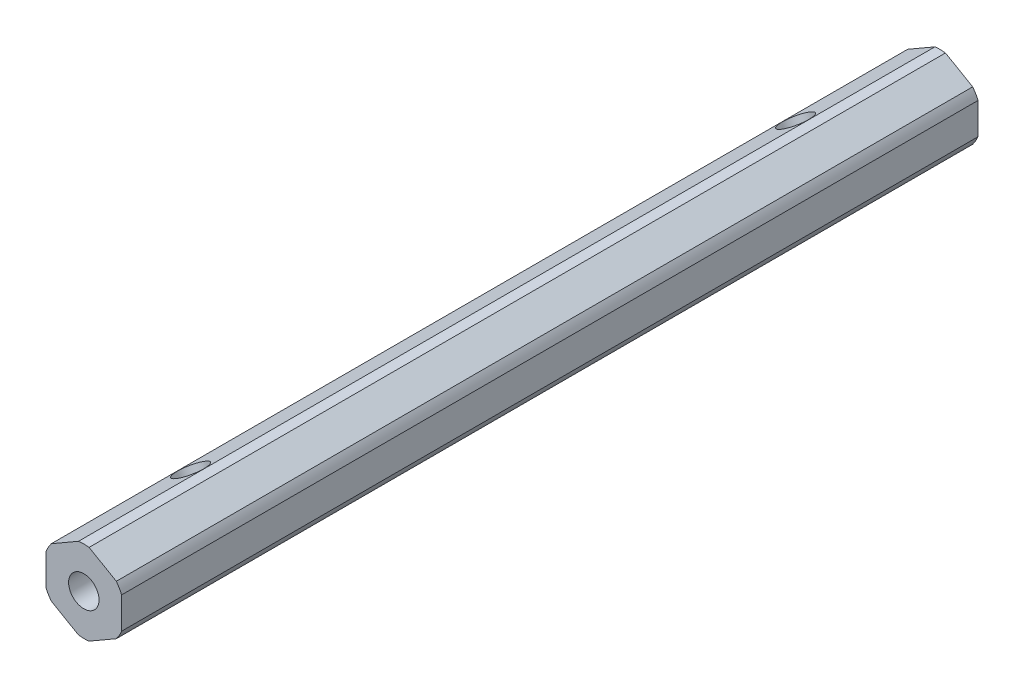
ISO-10303-21;
HEADER;
FILE_DESCRIPTION(('STEP AP214'),'2;1');
FILE_NAME('part.step','',(''),(''),'','','');
FILE_SCHEMA(('AUTOMOTIVE_DESIGN { 1 0 10303 214 1 1 1 1 }'));
ENDSEC;
DATA;
#1=APPLICATION_CONTEXT('core data for automotive mechanical design processes');
#2=APPLICATION_PROTOCOL_DEFINITION('international standard','automotive_design',2000,#1);
#3=PRODUCT_CONTEXT('',#1,'mechanical');
#4=PRODUCT('Part','Part','',(#3));
#5=PRODUCT_RELATED_PRODUCT_CATEGORY('part','',(#4));
#6=PRODUCT_DEFINITION_FORMATION('','',#4);
#7=PRODUCT_DEFINITION_CONTEXT('part definition',#1,'design');
#8=PRODUCT_DEFINITION('design','',#6,#7);
#9=PRODUCT_DEFINITION_SHAPE('','',#8);
#10=(LENGTH_UNIT() NAMED_UNIT(*) SI_UNIT(.MILLI.,.METRE.));
#11=(NAMED_UNIT(*) PLANE_ANGLE_UNIT() SI_UNIT($,.RADIAN.));
#12=(NAMED_UNIT(*) SI_UNIT($,.STERADIAN.) SOLID_ANGLE_UNIT());
#13=UNCERTAINTY_MEASURE_WITH_UNIT(LENGTH_MEASURE(1.E-05),#10,'distance_accuracy_value','');
#14=(GEOMETRIC_REPRESENTATION_CONTEXT(3) GLOBAL_UNCERTAINTY_ASSIGNED_CONTEXT((#13)) GLOBAL_UNIT_ASSIGNED_CONTEXT((#10,
#11,#12)) REPRESENTATION_CONTEXT('',''));
#15=CARTESIAN_POINT('',(0.,0.,0.));
#16=DIRECTION('',(0.,0.,1.));
#17=DIRECTION('',(1.,0.,0.));
#18=AXIS2_PLACEMENT_3D('',#15,#16,#17);
#19=CARTESIAN_POINT('',(0.,0.,457.2));
#20=DIRECTION('',(0.,0.,-1.));
#21=DIRECTION('',(-1.,0.,0.));
#22=AXIS2_PLACEMENT_3D('',#19,#20,#21);
#23=CYLINDRICAL_SURFACE('',#22,2.5527);
#24=CARTESIAN_POINT('',(0.,0.,-71.9105000000002));
#25=DIRECTION('',(0.,0.,1.));
#26=DIRECTION('',(1.,0.,0.));
#27=AXIS2_PLACEMENT_3D('',#24,#25,#26);
#28=CIRCLE('',#27,2.5527);
#29=CARTESIAN_POINT('',(2.5527,0.,-71.9105000000002));
#30=VERTEX_POINT('',#29);
#31=EDGE_CURVE('E165',#30,#30,#28,.F.);
#32=ORIENTED_EDGE('',*,*,#31,.T.);
#33=EDGE_LOOP('',(#32));
#34=FACE_BOUND('',#33,.T.);
#35=CARTESIAN_POINT('',(0.,0.,-50.8));
#36=DIRECTION('',(-0.353553390593274,0.612372435695794,-0.707106781186547));
#37=DIRECTION('',(0.353553390593274,-0.612372435695794,-0.707106781186547));
#38=AXIS2_PLACEMENT_3D('',#35,#36,#37);
#39=ELLIPSE('',#38,3.6100629606698,2.5527);
#40=CARTESIAN_POINT('',(-2.21070304824053,-1.27635,-50.8));
#41=VERTEX_POINT('',#40);
#42=CARTESIAN_POINT('',(2.21070304824053,1.27635,-50.8));
#43=VERTEX_POINT('',#42);
#44=EDGE_CURVE('E55',#41,#43,#39,.F.);
#45=ORIENTED_EDGE('',*,*,#44,.T.);
#46=CARTESIAN_POINT('',(0.,0.,-50.8));
#47=DIRECTION('',(0.353553390593274,-0.612372435695794,-0.707106781186547));
#48=DIRECTION('',(-0.353553390593274,0.612372435695794,-0.707106781186547));
#49=AXIS2_PLACEMENT_3D('',#46,#47,#48);
#50=ELLIPSE('',#49,3.6100629606698,2.5527);
#51=EDGE_CURVE('E12',#43,#41,#50,.F.);
#52=ORIENTED_EDGE('',*,*,#51,.T.);
#53=EDGE_LOOP('',(#45,#52));
#54=FACE_BOUND('',#53,.T.);
#55=ADVANCED_FACE('F42',(#34,#54),#23,.F.);
#56=CARTESIAN_POINT('',(0.,0.,-50.8));
#57=DIRECTION('',(-0.353553390593274,0.612372435695794,-0.707106781186547));
#58=DIRECTION('',(0.353553390593274,-0.612372435695794,-0.707106781186547));
#59=AXIS2_PLACEMENT_3D('',#56,#57,#58);
#60=ELLIPSE('',#59,3.6100629606698,2.5527);
#61=EDGE_CURVE('E144',#41,#43,#60,.T.);
#62=ORIENTED_EDGE('',*,*,#61,.T.);
#63=CARTESIAN_POINT('',(0.,0.,-50.8));
#64=DIRECTION('',(0.353553390593274,-0.612372435695794,-0.707106781186547));
#65=DIRECTION('',(-0.353553390593274,0.612372435695794,-0.707106781186547));
#66=AXIS2_PLACEMENT_3D('',#63,#64,#65);
#67=ELLIPSE('',#66,3.6100629606698,2.5527);
#68=EDGE_CURVE('E50',#43,#41,#67,.T.);
#69=ORIENTED_EDGE('',*,*,#68,.T.);
#70=EDGE_LOOP('',(#62,#69));
#71=FACE_BOUND('',#70,.T.);
#72=CARTESIAN_POINT('',(0.,0.,50.8));
#73=DIRECTION('',(-0.353553390593274,0.612372435695794,-0.707106781186547));
#74=DIRECTION('',(0.353553390593274,-0.612372435695794,-0.707106781186547));
#75=AXIS2_PLACEMENT_3D('',#72,#73,#74);
#76=ELLIPSE('',#75,3.6100629606698,2.5527);
#77=CARTESIAN_POINT('',(-2.21070304824054,-1.27635,50.8));
#78=VERTEX_POINT('',#77);
#79=CARTESIAN_POINT('',(2.21070304824053,1.27635,50.8));
#80=VERTEX_POINT('',#79);
#81=EDGE_CURVE('E62',#78,#80,#76,.F.);
#82=ORIENTED_EDGE('',*,*,#81,.T.);
#83=CARTESIAN_POINT('',(0.,0.,50.8));
#84=DIRECTION('',(0.353553390593274,-0.612372435695794,-0.707106781186547));
#85=DIRECTION('',(-0.353553390593274,0.612372435695794,-0.707106781186547));
#86=AXIS2_PLACEMENT_3D('',#83,#84,#85);
#87=ELLIPSE('',#86,3.6100629606698,2.5527);
#88=EDGE_CURVE('E152',#80,#78,#87,.F.);
#89=ORIENTED_EDGE('',*,*,#88,.T.);
#90=EDGE_LOOP('',(#82,#89));
#91=FACE_BOUND('',#90,.T.);
#92=ADVANCED_FACE('F154',(#71,#91),#23,.F.);
#93=CARTESIAN_POINT('',(6.35,3.66617420935412,457.2));
#94=DIRECTION('',(-0.5,-0.866025403784439,0.));
#95=DIRECTION('',(0.866025403784439,-0.5,0.));
#96=AXIS2_PLACEMENT_3D('',#93,#94,#95);
#97=PLANE('',#96);
#98=DIRECTION('',(0.,0.,-1.));
#99=VECTOR('',#98,1.);
#100=CARTESIAN_POINT('',(5.46158862213451,4.1790987575159,457.2));
#101=LINE('',#100,#99);
#102=CARTESIAN_POINT('',(5.46158862213451,4.1790987575159,-71.9105000000002));
#103=VERTEX_POINT('',#102);
#104=CARTESIAN_POINT('',(5.46158862213451,4.17909875751589,71.9104999999975));
#105=VERTEX_POINT('',#104);
#106=EDGE_CURVE('E177',#103,#105,#101,.F.);
#107=ORIENTED_EDGE('',*,*,#106,.F.);
#108=DIRECTION('',(-0.866025403784439,0.5,0.));
#109=VECTOR('',#108,1.);
#110=CARTESIAN_POINT('',(6.35,3.66617420935412,-71.9105000000002));
#111=LINE('',#110,#109);
#112=CARTESIAN_POINT('',(0.888411377865497,6.81942387054648,-71.9105000000002));
#113=VERTEX_POINT('',#112);
#114=EDGE_CURVE('E260',#103,#113,#111,.T.);
#115=ORIENTED_EDGE('',*,*,#114,.T.);
#116=DIRECTION('',(0.,0.,-1.));
#117=VECTOR('',#116,1.);
#118=CARTESIAN_POINT('',(0.888411377865497,6.81942387054648,457.2));
#119=LINE('',#118,#117);
#120=CARTESIAN_POINT('',(0.888411377865497,6.81942387054648,71.9104999999975));
#121=VERTEX_POINT('',#120);
#122=EDGE_CURVE('E164',#121,#113,#119,.T.);
#123=ORIENTED_EDGE('',*,*,#122,.F.);
#124=DIRECTION('',(0.866025403784439,-0.5,0.));
#125=VECTOR('',#124,1.);
#126=CARTESIAN_POINT('',(6.35,3.66617420935412,71.9104999999975));
#127=LINE('',#126,#125);
#128=EDGE_CURVE('E230',#121,#105,#127,.T.);
#129=ORIENTED_EDGE('',*,*,#128,.T.);
#130=EDGE_LOOP('',(#107,#115,#123,#129));
#131=FACE_BOUND('',#130,.T.);
#132=ADVANCED_FACE('F44',(#131),#97,.F.);
#133=CARTESIAN_POINT('',(0.,7.33234841870825,457.2));
#134=DIRECTION('',(0.5,-0.866025403784439,0.));
#135=DIRECTION('',(0.866025403784439,0.5,0.));
#136=AXIS2_PLACEMENT_3D('',#133,#134,#135);
#137=PLANE('',#136);
#138=CARTESIAN_POINT('',(-3.175,5.49926131403119,-50.8));
#139=DIRECTION('',(0.5,-0.866025403784439,0.));
#140=DIRECTION('',(0.866025403784439,0.5,0.));
#141=AXIS2_PLACEMENT_3D('',#138,#139,#140);
#142=CIRCLE('',#141,2.55269999999999);
#143=CARTESIAN_POINT('',(-0.964296951759469,6.77561131403118,-50.8));
#144=VERTEX_POINT('',#143);
#145=EDGE_CURVE('E272',#144,#144,#142,.T.);
#146=ORIENTED_EDGE('',*,*,#145,.T.);
#147=EDGE_LOOP('',(#146));
#148=FACE_BOUND('',#147,.T.);
#149=CARTESIAN_POINT('',(-3.17500000000001,5.49926131403118,50.8));
#150=DIRECTION('',(0.5,-0.866025403784439,0.));
#151=DIRECTION('',(0.866025403784439,0.5,0.));
#152=AXIS2_PLACEMENT_3D('',#149,#150,#151);
#153=CIRCLE('',#152,2.55269999999999);
#154=CARTESIAN_POINT('',(-0.964296951759474,6.77561131403118,50.8));
#155=VERTEX_POINT('',#154);
#156=EDGE_CURVE('E169',#155,#155,#153,.T.);
#157=ORIENTED_EDGE('',*,*,#156,.T.);
#158=EDGE_LOOP('',(#157));
#159=FACE_BOUND('',#158,.T.);
#160=DIRECTION('',(0.,0.,-1.));
#161=VECTOR('',#160,1.);
#162=CARTESIAN_POINT('',(-0.888411377865494,6.81942387054648,457.2));
#163=LINE('',#162,#161);
#164=CARTESIAN_POINT('',(-0.888411377865494,6.81942387054648,-71.9105000000002));
#165=VERTEX_POINT('',#164);
#166=CARTESIAN_POINT('',(-0.888411377865494,6.81942387054648,71.9104999999975));
#167=VERTEX_POINT('',#166);
#168=EDGE_CURVE('E182',#165,#167,#163,.F.);
#169=ORIENTED_EDGE('',*,*,#168,.F.);
#170=DIRECTION('',(-0.866025403784439,-0.5,0.));
#171=VECTOR('',#170,1.);
#172=CARTESIAN_POINT('',(0.,7.33234841870825,-71.9105000000002));
#173=LINE('',#172,#171);
#174=CARTESIAN_POINT('',(-5.46158862213451,4.1790987575159,-71.9105000000002));
#175=VERTEX_POINT('',#174);
#176=EDGE_CURVE('E250',#165,#175,#173,.T.);
#177=ORIENTED_EDGE('',*,*,#176,.T.);
#178=DIRECTION('',(0.,0.,-1.));
#179=VECTOR('',#178,1.);
#180=CARTESIAN_POINT('',(-5.46158862213451,4.1790987575159,457.2));
#181=LINE('',#180,#179);
#182=CARTESIAN_POINT('',(-5.46158862213451,4.1790987575159,71.9104999999975));
#183=VERTEX_POINT('',#182);
#184=EDGE_CURVE('E179',#183,#175,#181,.T.);
#185=ORIENTED_EDGE('',*,*,#184,.F.);
#186=DIRECTION('',(0.866025403784439,0.5,0.));
#187=VECTOR('',#186,1.);
#188=CARTESIAN_POINT('',(0.,7.33234841870825,71.9104999999975));
#189=LINE('',#188,#187);
#190=EDGE_CURVE('E218',#183,#167,#189,.T.);
#191=ORIENTED_EDGE('',*,*,#190,.T.);
#192=EDGE_LOOP('',(#169,#177,#185,#191));
#193=FACE_BOUND('',#192,.T.);
#194=ADVANCED_FACE('F326',(#148,#159,#193),#137,.F.);
#195=CARTESIAN_POINT('',(-6.35,3.66617420935413,457.2));
#196=DIRECTION('',(1.,0.,0.));
#197=DIRECTION('',(0.,0.,-1.));
#198=AXIS2_PLACEMENT_3D('',#195,#196,#197);
#199=PLANE('',#198);
#200=DIRECTION('',(0.,0.,-1.));
#201=VECTOR('',#200,1.);
#202=CARTESIAN_POINT('',(-6.35,2.64032511303059,457.2));
#203=LINE('',#202,#201);
#204=CARTESIAN_POINT('',(-6.35,2.64032511303059,-71.9105000000002));
#205=VERTEX_POINT('',#204);
#206=CARTESIAN_POINT('',(-6.35,2.64032511303059,71.9104999999975));
#207=VERTEX_POINT('',#206);
#208=EDGE_CURVE('E187',#205,#207,#203,.F.);
#209=ORIENTED_EDGE('',*,*,#208,.F.);
#210=DIRECTION('',(0.,-1.,0.));
#211=VECTOR('',#210,1.);
#212=CARTESIAN_POINT('',(-6.35,3.66617420935413,-71.9105000000002));
#213=LINE('',#212,#211);
#214=CARTESIAN_POINT('',(-6.35,-2.64032511303059,-71.9105000000002));
#215=VERTEX_POINT('',#214);
#216=EDGE_CURVE('E240',#205,#215,#213,.T.);
#217=ORIENTED_EDGE('',*,*,#216,.T.);
#218=DIRECTION('',(0.,0.,-1.));
#219=VECTOR('',#218,1.);
#220=CARTESIAN_POINT('',(-6.35,-2.64032511303059,457.2));
#221=LINE('',#220,#219);
#222=CARTESIAN_POINT('',(-6.35,-2.64032511303059,71.9104999999975));
#223=VERTEX_POINT('',#222);
#224=EDGE_CURVE('E184',#223,#215,#221,.T.);
#225=ORIENTED_EDGE('',*,*,#224,.F.);
#226=DIRECTION('',(0.,1.,0.));
#227=VECTOR('',#226,1.);
#228=CARTESIAN_POINT('',(-6.35,3.66617420935413,71.9104999999975));
#229=LINE('',#228,#227);
#230=EDGE_CURVE('E206',#223,#207,#229,.T.);
#231=ORIENTED_EDGE('',*,*,#230,.T.);
#232=EDGE_LOOP('',(#209,#217,#225,#231));
#233=FACE_BOUND('',#232,.T.);
#234=ADVANCED_FACE('F319',(#233),#199,.F.);
#235=CARTESIAN_POINT('',(-6.35,-3.66617420935413,457.2));
#236=DIRECTION('',(0.5,0.866025403784439,0.));
#237=DIRECTION('',(-0.866025403784439,0.5,0.));
#238=AXIS2_PLACEMENT_3D('',#235,#236,#237);
#239=PLANE('',#238);
#240=DIRECTION('',(0.,0.,-1.));
#241=VECTOR('',#240,1.);
#242=CARTESIAN_POINT('',(-5.4615886221345,-4.1790987575159,457.2));
#243=LINE('',#242,#241);
#244=CARTESIAN_POINT('',(-5.4615886221345,-4.1790987575159,-71.9105000000002));
#245=VERTEX_POINT('',#244);
#246=CARTESIAN_POINT('',(-5.4615886221345,-4.1790987575159,71.9104999999975));
#247=VERTEX_POINT('',#246);
#248=EDGE_CURVE('E192',#245,#247,#243,.F.);
#249=ORIENTED_EDGE('',*,*,#248,.F.);
#250=DIRECTION('',(0.866025403784439,-0.5,0.));
#251=VECTOR('',#250,1.);
#252=CARTESIAN_POINT('',(-6.35,-3.66617420935413,-71.9105000000002));
#253=LINE('',#252,#251);
#254=CARTESIAN_POINT('',(-0.888411377865503,-6.81942387054648,-71.9105000000002));
#255=VERTEX_POINT('',#254);
#256=EDGE_CURVE('E242',#245,#255,#253,.T.);
#257=ORIENTED_EDGE('',*,*,#256,.T.);
#258=DIRECTION('',(0.,0.,-1.));
#259=VECTOR('',#258,1.);
#260=CARTESIAN_POINT('',(-0.888411377865503,-6.81942387054648,457.2));
#261=LINE('',#260,#259);
#262=CARTESIAN_POINT('',(-0.888411377865503,-6.81942387054648,71.9104999999975));
#263=VERTEX_POINT('',#262);
#264=EDGE_CURVE('E189',#263,#255,#261,.T.);
#265=ORIENTED_EDGE('',*,*,#264,.F.);
#266=DIRECTION('',(-0.866025403784439,0.5,0.));
#267=VECTOR('',#266,1.);
#268=CARTESIAN_POINT('',(-6.35,-3.66617420935413,71.9104999999975));
#269=LINE('',#268,#267);
#270=EDGE_CURVE('E209',#263,#247,#269,.T.);
#271=ORIENTED_EDGE('',*,*,#270,.T.);
#272=EDGE_LOOP('',(#249,#257,#265,#271));
#273=FACE_BOUND('',#272,.T.);
#274=ADVANCED_FACE('F284',(#273),#239,.F.);
#275=CARTESIAN_POINT('',(0.,-7.33234841870825,457.2));
#276=DIRECTION('',(-0.5,0.866025403784439,0.));
#277=DIRECTION('',(-0.866025403784439,-0.5,0.));
#278=AXIS2_PLACEMENT_3D('',#275,#276,#277);
#279=PLANE('',#278);
#280=CARTESIAN_POINT('',(3.175,-5.49926131403119,-50.8));
#281=DIRECTION('',(0.5,-0.866025403784439,0.));
#282=DIRECTION('',(0.866025403784439,0.5,0.));
#283=AXIS2_PLACEMENT_3D('',#280,#281,#282);
#284=CIRCLE('',#283,2.55269999999999);
#285=CARTESIAN_POINT('',(5.38570304824053,-4.22291131403119,-50.8));
#286=VERTEX_POINT('',#285);
#287=EDGE_CURVE('E275',#286,#286,#284,.T.);
#288=ORIENTED_EDGE('',*,*,#287,.F.);
#289=EDGE_LOOP('',(#288));
#290=FACE_BOUND('',#289,.T.);
#291=CARTESIAN_POINT('',(3.17499999999999,-5.49926131403119,50.8));
#292=DIRECTION('',(0.5,-0.866025403784439,0.));
#293=DIRECTION('',(0.866025403784439,0.5,0.));
#294=AXIS2_PLACEMENT_3D('',#291,#292,#293);
#295=CIRCLE('',#294,2.55269999999999);
#296=CARTESIAN_POINT('',(5.38570304824052,-4.2229113140312,50.8));
#297=VERTEX_POINT('',#296);
#298=EDGE_CURVE('E269',#297,#297,#295,.T.);
#299=ORIENTED_EDGE('',*,*,#298,.F.);
#300=EDGE_LOOP('',(#299));
#301=FACE_BOUND('',#300,.T.);
#302=DIRECTION('',(0.,0.,-1.));
#303=VECTOR('',#302,1.);
#304=CARTESIAN_POINT('',(0.888411377865483,-6.81942387054648,457.2));
#305=LINE('',#304,#303);
#306=CARTESIAN_POINT('',(0.888411377865483,-6.81942387054648,-71.9105000000002));
#307=VERTEX_POINT('',#306);
#308=CARTESIAN_POINT('',(0.888411377865483,-6.81942387054648,71.9104999999975));
#309=VERTEX_POINT('',#308);
#310=EDGE_CURVE('E197',#307,#309,#305,.F.);
#311=ORIENTED_EDGE('',*,*,#310,.F.);
#312=DIRECTION('',(0.866025403784439,0.5,0.));
#313=VECTOR('',#312,1.);
#314=CARTESIAN_POINT('',(0.,-7.33234841870825,-71.9105000000002));
#315=LINE('',#314,#313);
#316=CARTESIAN_POINT('',(5.46158862213451,-4.17909875751589,-71.9105000000002));
#317=VERTEX_POINT('',#316);
#318=EDGE_CURVE('E252',#307,#317,#315,.T.);
#319=ORIENTED_EDGE('',*,*,#318,.T.);
#320=DIRECTION('',(0.,0.,-1.));
#321=VECTOR('',#320,1.);
#322=CARTESIAN_POINT('',(5.46158862213451,-4.17909875751589,457.2));
#323=LINE('',#322,#321);
#324=CARTESIAN_POINT('',(5.46158862213451,-4.17909875751589,71.9104999999975));
#325=VERTEX_POINT('',#324);
#326=EDGE_CURVE('E194',#325,#317,#323,.T.);
#327=ORIENTED_EDGE('',*,*,#326,.F.);
#328=DIRECTION('',(-0.866025403784439,-0.5,0.));
#329=VECTOR('',#328,1.);
#330=CARTESIAN_POINT('',(0.,-7.33234841870825,71.9104999999975));
#331=LINE('',#330,#329);
#332=EDGE_CURVE('E221',#325,#309,#331,.T.);
#333=ORIENTED_EDGE('',*,*,#332,.T.);
#334=EDGE_LOOP('',(#311,#319,#327,#333));
#335=FACE_BOUND('',#334,.T.);
#336=ADVANCED_FACE('F280',(#290,#301,#335),#279,.F.);
#337=CARTESIAN_POINT('',(6.35,-3.66617420935413,457.2));
#338=DIRECTION('',(-1.,0.,0.));
#339=DIRECTION('',(0.,0.,1.));
#340=AXIS2_PLACEMENT_3D('',#337,#338,#339);
#341=PLANE('',#340);
#342=DIRECTION('',(0.,0.,-1.));
#343=VECTOR('',#342,1.);
#344=CARTESIAN_POINT('',(6.35,-2.64032511303059,457.2));
#345=LINE('',#344,#343);
#346=CARTESIAN_POINT('',(6.35,-2.64032511303059,-71.9105000000002));
#347=VERTEX_POINT('',#346);
#348=CARTESIAN_POINT('',(6.35,-2.64032511303059,71.9104999999975));
#349=VERTEX_POINT('',#348);
#350=EDGE_CURVE('E201',#347,#349,#345,.F.);
#351=ORIENTED_EDGE('',*,*,#350,.F.);
#352=DIRECTION('',(0.,1.,0.));
#353=VECTOR('',#352,1.);
#354=CARTESIAN_POINT('',(6.35,-3.66617420935413,-71.9105000000002));
#355=LINE('',#354,#353);
#356=CARTESIAN_POINT('',(6.35,2.64032511303059,-71.9105000000002));
#357=VERTEX_POINT('',#356);
#358=EDGE_CURVE('E262',#347,#357,#355,.T.);
#359=ORIENTED_EDGE('',*,*,#358,.T.);
#360=DIRECTION('',(0.,0.,-1.));
#361=VECTOR('',#360,1.);
#362=CARTESIAN_POINT('',(6.35,2.64032511303059,457.2));
#363=LINE('',#362,#361);
#364=CARTESIAN_POINT('',(6.35,2.64032511303059,71.9104999999975));
#365=VERTEX_POINT('',#364);
#366=EDGE_CURVE('E199',#365,#357,#363,.T.);
#367=ORIENTED_EDGE('',*,*,#366,.F.);
#368=DIRECTION('',(0.,-1.,0.));
#369=VECTOR('',#368,1.);
#370=CARTESIAN_POINT('',(6.35,-3.66617420935413,71.9104999999975));
#371=LINE('',#370,#369);
#372=EDGE_CURVE('E233',#365,#349,#371,.T.);
#373=ORIENTED_EDGE('',*,*,#372,.T.);
#374=EDGE_LOOP('',(#351,#359,#367,#373));
#375=FACE_BOUND('',#374,.T.);
#376=ADVANCED_FACE('F283',(#375),#341,.F.);
#377=CARTESIAN_POINT('',(0.,0.,457.2));
#378=DIRECTION('',(0.,0.,-1.));
#379=DIRECTION('',(-1.,0.,0.));
#380=AXIS2_PLACEMENT_3D('',#377,#378,#379);
#381=CYLINDRICAL_SURFACE('',#380,6.87705);
#382=CARTESIAN_POINT('',(0.,0.,-71.9105000000002));
#383=DIRECTION('',(0.,0.,1.));
#384=DIRECTION('',(1.,0.,0.));
#385=AXIS2_PLACEMENT_3D('',#382,#383,#384);
#386=CIRCLE('',#385,6.87705);
#387=EDGE_CURVE('E254',#347,#317,#386,.F.);
#388=ORIENTED_EDGE('',*,*,#387,.F.);
#389=ORIENTED_EDGE('',*,*,#350,.T.);
#390=CARTESIAN_POINT('',(0.,0.,71.9104999999975));
#391=DIRECTION('',(0.,0.,-1.));
#392=DIRECTION('',(-1.,0.,0.));
#393=AXIS2_PLACEMENT_3D('',#390,#391,#392);
#394=CIRCLE('',#393,6.87705);
#395=EDGE_CURVE('E224',#325,#349,#394,.F.);
#396=ORIENTED_EDGE('',*,*,#395,.F.);
#397=ORIENTED_EDGE('',*,*,#326,.T.);
#398=EDGE_LOOP('',(#388,#389,#396,#397));
#399=FACE_BOUND('',#398,.T.);
#400=ADVANCED_FACE('F300',(#399),#381,.T.);
#401=CARTESIAN_POINT('',(0.,0.,-71.9105000000002));
#402=DIRECTION('',(0.,0.,1.));
#403=DIRECTION('',(1.,0.,0.));
#404=AXIS2_PLACEMENT_3D('',#401,#402,#403);
#405=CIRCLE('',#404,6.87705);
#406=EDGE_CURVE('E244',#307,#255,#405,.F.);
#407=ORIENTED_EDGE('',*,*,#406,.F.);
#408=ORIENTED_EDGE('',*,*,#310,.T.);
#409=CARTESIAN_POINT('',(0.,0.,71.9104999999975));
#410=DIRECTION('',(0.,0.,-1.));
#411=DIRECTION('',(-1.,0.,0.));
#412=AXIS2_PLACEMENT_3D('',#409,#410,#411);
#413=CIRCLE('',#412,6.87705);
#414=EDGE_CURVE('E212',#263,#309,#413,.F.);
#415=ORIENTED_EDGE('',*,*,#414,.F.);
#416=ORIENTED_EDGE('',*,*,#264,.T.);
#417=EDGE_LOOP('',(#407,#408,#415,#416));
#418=FACE_BOUND('',#417,.T.);
#419=ADVANCED_FACE('F310',(#418),#381,.T.);
#420=CARTESIAN_POINT('',(0.,0.,-71.9105000000002));
#421=DIRECTION('',(0.,0.,1.));
#422=DIRECTION('',(1.,0.,0.));
#423=AXIS2_PLACEMENT_3D('',#420,#421,#422);
#424=CIRCLE('',#423,6.87705);
#425=EDGE_CURVE('E174',#245,#215,#424,.F.);
#426=ORIENTED_EDGE('',*,*,#425,.F.);
#427=ORIENTED_EDGE('',*,*,#248,.T.);
#428=CARTESIAN_POINT('',(0.,0.,71.9104999999975));
#429=DIRECTION('',(0.,0.,-1.));
#430=DIRECTION('',(-1.,0.,0.));
#431=AXIS2_PLACEMENT_3D('',#428,#429,#430);
#432=CIRCLE('',#431,6.87705);
#433=EDGE_CURVE('E203',#223,#247,#432,.F.);
#434=ORIENTED_EDGE('',*,*,#433,.F.);
#435=ORIENTED_EDGE('',*,*,#224,.T.);
#436=EDGE_LOOP('',(#426,#427,#434,#435));
#437=FACE_BOUND('',#436,.T.);
#438=ADVANCED_FACE('F315',(#437),#381,.T.);
#439=CARTESIAN_POINT('',(0.,0.,-71.9105000000002));
#440=DIRECTION('',(0.,0.,1.));
#441=DIRECTION('',(1.,0.,0.));
#442=AXIS2_PLACEMENT_3D('',#439,#440,#441);
#443=CIRCLE('',#442,6.87705);
#444=EDGE_CURVE('E247',#205,#175,#443,.F.);
#445=ORIENTED_EDGE('',*,*,#444,.F.);
#446=ORIENTED_EDGE('',*,*,#208,.T.);
#447=CARTESIAN_POINT('',(0.,0.,71.9104999999975));
#448=DIRECTION('',(0.,0.,-1.));
#449=DIRECTION('',(-1.,0.,0.));
#450=AXIS2_PLACEMENT_3D('',#447,#448,#449);
#451=CIRCLE('',#450,6.87705);
#452=EDGE_CURVE('E215',#183,#207,#451,.F.);
#453=ORIENTED_EDGE('',*,*,#452,.F.);
#454=ORIENTED_EDGE('',*,*,#184,.T.);
#455=EDGE_LOOP('',(#445,#446,#453,#454));
#456=FACE_BOUND('',#455,.T.);
#457=ADVANCED_FACE('F323',(#456),#381,.T.);
#458=CARTESIAN_POINT('',(0.,0.,-71.9105000000002));
#459=DIRECTION('',(0.,0.,1.));
#460=DIRECTION('',(1.,0.,0.));
#461=AXIS2_PLACEMENT_3D('',#458,#459,#460);
#462=CIRCLE('',#461,6.87705);
#463=EDGE_CURVE('E257',#165,#113,#462,.F.);
#464=ORIENTED_EDGE('',*,*,#463,.F.);
#465=ORIENTED_EDGE('',*,*,#168,.T.);
#466=CARTESIAN_POINT('',(0.,0.,71.9104999999975));
#467=DIRECTION('',(0.,0.,-1.));
#468=DIRECTION('',(-1.,0.,0.));
#469=AXIS2_PLACEMENT_3D('',#466,#467,#468);
#470=CIRCLE('',#469,6.87705);
#471=EDGE_CURVE('E227',#121,#167,#470,.F.);
#472=ORIENTED_EDGE('',*,*,#471,.F.);
#473=ORIENTED_EDGE('',*,*,#122,.T.);
#474=EDGE_LOOP('',(#464,#465,#472,#473));
#475=FACE_BOUND('',#474,.T.);
#476=ADVANCED_FACE('F330',(#475),#381,.T.);
#477=CARTESIAN_POINT('',(0.,0.,-71.9105000000002));
#478=DIRECTION('',(0.,0.,1.));
#479=DIRECTION('',(1.,0.,0.));
#480=AXIS2_PLACEMENT_3D('',#477,#478,#479);
#481=CIRCLE('',#480,6.87705);
#482=EDGE_CURVE('E168',#103,#357,#481,.F.);
#483=ORIENTED_EDGE('',*,*,#482,.F.);
#484=ORIENTED_EDGE('',*,*,#106,.T.);
#485=CARTESIAN_POINT('',(0.,0.,71.9104999999975));
#486=DIRECTION('',(0.,0.,-1.));
#487=DIRECTION('',(-1.,0.,0.));
#488=AXIS2_PLACEMENT_3D('',#485,#486,#487);
#489=CIRCLE('',#488,6.87705);
#490=EDGE_CURVE('E173',#365,#105,#489,.F.);
#491=ORIENTED_EDGE('',*,*,#490,.F.);
#492=ORIENTED_EDGE('',*,*,#366,.T.);
#493=EDGE_LOOP('',(#483,#484,#491,#492));
#494=FACE_BOUND('',#493,.T.);
#495=ADVANCED_FACE('F336',(#494),#381,.T.);
#496=CARTESIAN_POINT('',(0.,0.,50.8));
#497=DIRECTION('',(-0.353553390593274,0.612372435695794,-0.707106781186547));
#498=DIRECTION('',(0.353553390593274,-0.612372435695794,-0.707106781186547));
#499=AXIS2_PLACEMENT_3D('',#496,#497,#498);
#500=ELLIPSE('',#499,3.6100629606698,2.5527);
#501=EDGE_CURVE('E160',#78,#80,#500,.T.);
#502=ORIENTED_EDGE('',*,*,#501,.T.);
#503=CARTESIAN_POINT('',(0.,0.,50.8));
#504=DIRECTION('',(0.353553390593274,-0.612372435695794,-0.707106781186547));
#505=DIRECTION('',(-0.353553390593274,0.612372435695794,-0.707106781186547));
#506=AXIS2_PLACEMENT_3D('',#503,#504,#505);
#507=ELLIPSE('',#506,3.6100629606698,2.5527);
#508=EDGE_CURVE('E157',#80,#78,#507,.T.);
#509=ORIENTED_EDGE('',*,*,#508,.T.);
#510=EDGE_LOOP('',(#502,#509));
#511=FACE_BOUND('',#510,.T.);
#512=CARTESIAN_POINT('',(0.,0.,71.9104999999975));
#513=DIRECTION('',(0.,0.,-1.));
#514=DIRECTION('',(-1.,0.,0.));
#515=AXIS2_PLACEMENT_3D('',#512,#513,#514);
#516=CIRCLE('',#515,2.5527);
#517=CARTESIAN_POINT('',(-2.5527,0.,71.9104999999975));
#518=VERTEX_POINT('',#517);
#519=EDGE_CURVE('E170',#518,#518,#516,.F.);
#520=ORIENTED_EDGE('',*,*,#519,.T.);
#521=EDGE_LOOP('',(#520));
#522=FACE_BOUND('',#521,.T.);
#523=ADVANCED_FACE('F338',(#511,#522),#23,.F.);
#524=CARTESIAN_POINT('',(0.,-1.0222280435009E-13,71.9104999999975));
#525=DIRECTION('',(0.,0.,-1.));
#526=DIRECTION('',(-1.,0.,0.));
#527=AXIS2_PLACEMENT_3D('',#524,#525,#526);
#528=PLANE('',#527);
#529=ORIENTED_EDGE('',*,*,#230,.F.);
#530=ORIENTED_EDGE('',*,*,#433,.T.);
#531=ORIENTED_EDGE('',*,*,#270,.F.);
#532=ORIENTED_EDGE('',*,*,#414,.T.);
#533=ORIENTED_EDGE('',*,*,#332,.F.);
#534=ORIENTED_EDGE('',*,*,#395,.T.);
#535=ORIENTED_EDGE('',*,*,#372,.F.);
#536=ORIENTED_EDGE('',*,*,#490,.T.);
#537=ORIENTED_EDGE('',*,*,#128,.F.);
#538=ORIENTED_EDGE('',*,*,#471,.T.);
#539=ORIENTED_EDGE('',*,*,#190,.F.);
#540=ORIENTED_EDGE('',*,*,#452,.T.);
#541=EDGE_LOOP('',(#529,#530,#531,#532,#533,#534,#535,#536,#537,#538,#539,#540));
#542=FACE_BOUND('',#541,.T.);
#543=ORIENTED_EDGE('',*,*,#519,.F.);
#544=EDGE_LOOP('',(#543));
#545=FACE_BOUND('',#544,.T.);
#546=ADVANCED_FACE('F306',(#542,#545),#528,.F.);
#547=CARTESIAN_POINT('',(0.,0.,-71.9105000000001));
#548=DIRECTION('',(0.,0.,1.));
#549=DIRECTION('',(1.,0.,0.));
#550=AXIS2_PLACEMENT_3D('',#547,#548,#549);
#551=PLANE('',#550);
#552=ORIENTED_EDGE('',*,*,#256,.F.);
#553=ORIENTED_EDGE('',*,*,#425,.T.);
#554=ORIENTED_EDGE('',*,*,#216,.F.);
#555=ORIENTED_EDGE('',*,*,#444,.T.);
#556=ORIENTED_EDGE('',*,*,#176,.F.);
#557=ORIENTED_EDGE('',*,*,#463,.T.);
#558=ORIENTED_EDGE('',*,*,#114,.F.);
#559=ORIENTED_EDGE('',*,*,#482,.T.);
#560=ORIENTED_EDGE('',*,*,#358,.F.);
#561=ORIENTED_EDGE('',*,*,#387,.T.);
#562=ORIENTED_EDGE('',*,*,#318,.F.);
#563=ORIENTED_EDGE('',*,*,#406,.T.);
#564=EDGE_LOOP('',(#552,#553,#554,#555,#556,#557,#558,#559,#560,#561,#562,#563));
#565=FACE_BOUND('',#564,.T.);
#566=ORIENTED_EDGE('',*,*,#31,.F.);
#567=EDGE_LOOP('',(#566));
#568=FACE_BOUND('',#567,.T.);
#569=ADVANCED_FACE('F295',(#565,#568),#551,.F.);
#570=CARTESIAN_POINT('',(3.17499999999999,-5.49926131403119,50.8));
#571=DIRECTION('',(0.5,-0.866025403784439,0.));
#572=DIRECTION('',(0.866025403784439,0.5,0.));
#573=AXIS2_PLACEMENT_3D('',#570,#571,#572);
#574=CYLINDRICAL_SURFACE('',#573,2.55269999999999);
#575=ORIENTED_EDGE('',*,*,#298,.T.);
#576=EDGE_LOOP('',(#575));
#577=FACE_BOUND('',#576,.T.);
#578=ORIENTED_EDGE('',*,*,#81,.F.);
#579=ORIENTED_EDGE('',*,*,#508,.F.);
#580=EDGE_LOOP('',(#578,#579));
#581=FACE_BOUND('',#580,.T.);
#582=ADVANCED_FACE('F360',(#577,#581),#574,.F.);
#583=ORIENTED_EDGE('',*,*,#501,.F.);
#584=ORIENTED_EDGE('',*,*,#88,.F.);
#585=EDGE_LOOP('',(#583,#584));
#586=FACE_BOUND('',#585,.T.);
#587=ORIENTED_EDGE('',*,*,#156,.F.);
#588=EDGE_LOOP('',(#587));
#589=FACE_BOUND('',#588,.T.);
#590=ADVANCED_FACE('F361',(#586,#589),#574,.F.);
#591=CARTESIAN_POINT('',(3.175,-5.49926131403119,-50.8));
#592=DIRECTION('',(0.5,-0.866025403784439,0.));
#593=DIRECTION('',(0.866025403784439,0.5,0.));
#594=AXIS2_PLACEMENT_3D('',#591,#592,#593);
#595=CYLINDRICAL_SURFACE('',#594,2.55269999999999);
#596=ORIENTED_EDGE('',*,*,#287,.T.);
#597=EDGE_LOOP('',(#596));
#598=FACE_BOUND('',#597,.T.);
#599=ORIENTED_EDGE('',*,*,#44,.F.);
#600=ORIENTED_EDGE('',*,*,#68,.F.);
#601=EDGE_LOOP('',(#599,#600));
#602=FACE_BOUND('',#601,.T.);
#603=ADVANCED_FACE('F151',(#598,#602),#595,.F.);
#604=ORIENTED_EDGE('',*,*,#61,.F.);
#605=ORIENTED_EDGE('',*,*,#51,.F.);
#606=EDGE_LOOP('',(#604,#605));
#607=FACE_BOUND('',#606,.T.);
#608=ORIENTED_EDGE('',*,*,#145,.F.);
#609=EDGE_LOOP('',(#608));
#610=FACE_BOUND('',#609,.T.);
#611=ADVANCED_FACE('F145',(#607,#610),#595,.F.);
#612=CLOSED_SHELL('',(#55,#92,#132,#194,#234,#274,#336,#376,#400,#419,#438,#457,#476,#495,#523,
#546,#569,#582,#590,#603,#611));
#613=MANIFOLD_SOLID_BREP('B2',#612);
#614=ADVANCED_BREP_SHAPE_REPRESENTATION('',(#18,#613),#14);
#615=SHAPE_DEFINITION_REPRESENTATION(#9,#614);
ENDSEC;
END-ISO-10303-21;
